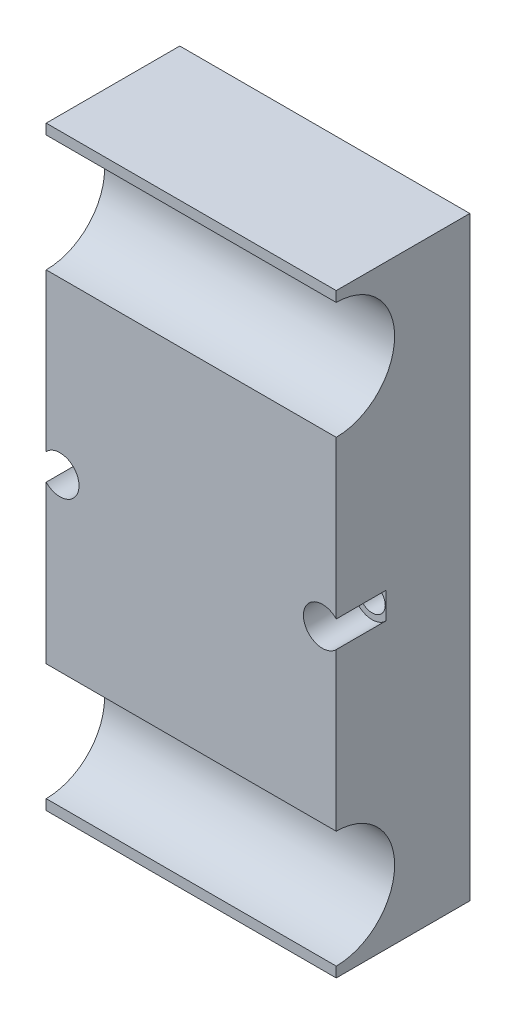
ISO-10303-21;
HEADER;
FILE_DESCRIPTION(('STEP AP214'),'2;1');
FILE_NAME('part.step','',(''),(''),'','','');
FILE_SCHEMA(('AUTOMOTIVE_DESIGN { 1 0 10303 214 1 1 1 1 }'));
ENDSEC;
DATA;
#1=APPLICATION_CONTEXT('core data for automotive mechanical design processes');
#2=APPLICATION_PROTOCOL_DEFINITION('international standard','automotive_design',2000,#1);
#3=PRODUCT_CONTEXT('',#1,'mechanical');
#4=PRODUCT('Part','Part','',(#3));
#5=PRODUCT_RELATED_PRODUCT_CATEGORY('part','',(#4));
#6=PRODUCT_DEFINITION_FORMATION('','',#4);
#7=PRODUCT_DEFINITION_CONTEXT('part definition',#1,'design');
#8=PRODUCT_DEFINITION('design','',#6,#7);
#9=PRODUCT_DEFINITION_SHAPE('','',#8);
#10=(LENGTH_UNIT() NAMED_UNIT(*) SI_UNIT(.MILLI.,.METRE.));
#11=(NAMED_UNIT(*) PLANE_ANGLE_UNIT() SI_UNIT($,.RADIAN.));
#12=(NAMED_UNIT(*) SI_UNIT($,.STERADIAN.) SOLID_ANGLE_UNIT());
#13=UNCERTAINTY_MEASURE_WITH_UNIT(LENGTH_MEASURE(1.E-05),#10,'distance_accuracy_value','');
#14=(GEOMETRIC_REPRESENTATION_CONTEXT(3) GLOBAL_UNCERTAINTY_ASSIGNED_CONTEXT((#13)) GLOBAL_UNIT_ASSIGNED_CONTEXT((#10,
#11,#12)) REPRESENTATION_CONTEXT('',''));
#15=CARTESIAN_POINT('',(0.,0.,0.));
#16=DIRECTION('',(0.,0.,1.));
#17=DIRECTION('',(1.,0.,0.));
#18=AXIS2_PLACEMENT_3D('',#15,#16,#17);
#19=CARTESIAN_POINT('',(36.2,39.,0.));
#20=DIRECTION('',(0.,0.,1.));
#21=DIRECTION('',(1.,0.,0.));
#22=AXIS2_PLACEMENT_3D('',#19,#20,#21);
#23=CYLINDRICAL_SURFACE('',#22,1.725);
#24=CARTESIAN_POINT('',(36.2,39.,0.));
#25=DIRECTION('',(0.,0.,1.));
#26=DIRECTION('',(1.,0.,0.));
#27=AXIS2_PLACEMENT_3D('',#24,#25,#26);
#28=CIRCLE('',#27,1.725);
#29=CARTESIAN_POINT('',(36.25,37.275724789948,0.));
#30=VERTEX_POINT('',#29);
#31=CARTESIAN_POINT('',(36.25,40.724275210052,0.));
#32=VERTEX_POINT('',#31);
#33=EDGE_CURVE('E423',#30,#32,#28,.T.);
#34=ORIENTED_EDGE('',*,*,#33,.F.);
#35=DIRECTION('',(0.,0.,1.));
#36=VECTOR('',#35,1.);
#37=CARTESIAN_POINT('',(36.25,37.275724789948,0.));
#38=LINE('',#37,#36);
#39=CARTESIAN_POINT('',(36.25,37.275724789948,1.));
#40=VERTEX_POINT('',#39);
#41=EDGE_CURVE('E426',#40,#30,#38,.F.);
#42=ORIENTED_EDGE('',*,*,#41,.F.);
#43=CARTESIAN_POINT('',(36.2,39.,1.));
#44=DIRECTION('',(0.,0.,-1.));
#45=DIRECTION('',(-1.,0.,0.));
#46=AXIS2_PLACEMENT_3D('',#43,#44,#45);
#47=CIRCLE('',#46,1.725);
#48=CARTESIAN_POINT('',(36.25,40.724275210052,1.));
#49=VERTEX_POINT('',#48);
#50=EDGE_CURVE('E400',#40,#49,#47,.T.);
#51=ORIENTED_EDGE('',*,*,#50,.T.);
#52=DIRECTION('',(0.,0.,1.));
#53=VECTOR('',#52,1.);
#54=CARTESIAN_POINT('',(36.25,40.724275210052,0.));
#55=LINE('',#54,#53);
#56=EDGE_CURVE('E429',#32,#49,#55,.T.);
#57=ORIENTED_EDGE('',*,*,#56,.F.);
#58=EDGE_LOOP('',(#34,#42,#51,#57));
#59=FACE_BOUND('',#58,.T.);
#60=CARTESIAN_POINT('',(36.2,39.,11.));
#61=DIRECTION('',(0.,0.,1.));
#62=DIRECTION('',(1.,0.,0.));
#63=AXIS2_PLACEMENT_3D('',#60,#61,#62);
#64=CIRCLE('',#63,1.725);
#65=CARTESIAN_POINT('',(37.925,39.,11.));
#66=VERTEX_POINT('',#65);
#67=EDGE_CURVE('E411',#66,#66,#64,.F.);
#68=ORIENTED_EDGE('',*,*,#67,.F.);
#69=EDGE_LOOP('',(#68));
#70=FACE_BOUND('',#69,.T.);
#71=ADVANCED_FACE('F35',(#59,#70),#23,.F.);
#72=CARTESIAN_POINT('',(1.8,39.,0.));
#73=DIRECTION('',(0.,0.,1.));
#74=DIRECTION('',(1.,0.,0.));
#75=AXIS2_PLACEMENT_3D('',#72,#73,#74);
#76=CYLINDRICAL_SURFACE('',#75,1.725);
#77=CARTESIAN_POINT('',(1.8,39.,0.));
#78=DIRECTION('',(0.,0.,1.));
#79=DIRECTION('',(1.,0.,0.));
#80=AXIS2_PLACEMENT_3D('',#77,#78,#79);
#81=CIRCLE('',#80,1.725);
#82=CARTESIAN_POINT('',(1.75000000000001,40.724275210052,0.));
#83=VERTEX_POINT('',#82);
#84=CARTESIAN_POINT('',(1.75,37.275724789948,0.));
#85=VERTEX_POINT('',#84);
#86=EDGE_CURVE('E432',#83,#85,#81,.T.);
#87=ORIENTED_EDGE('',*,*,#86,.F.);
#88=DIRECTION('',(0.,0.,1.));
#89=VECTOR('',#88,1.);
#90=CARTESIAN_POINT('',(1.75000000000001,40.724275210052,0.));
#91=LINE('',#90,#89);
#92=CARTESIAN_POINT('',(1.75000000000001,40.724275210052,1.));
#93=VERTEX_POINT('',#92);
#94=EDGE_CURVE('E435',#93,#83,#91,.F.);
#95=ORIENTED_EDGE('',*,*,#94,.F.);
#96=CARTESIAN_POINT('',(1.8,39.,1.));
#97=DIRECTION('',(0.,0.,-1.));
#98=DIRECTION('',(-1.,0.,0.));
#99=AXIS2_PLACEMENT_3D('',#96,#97,#98);
#100=CIRCLE('',#99,1.725);
#101=CARTESIAN_POINT('',(1.75,37.275724789948,1.));
#102=VERTEX_POINT('',#101);
#103=EDGE_CURVE('E398',#93,#102,#100,.T.);
#104=ORIENTED_EDGE('',*,*,#103,.T.);
#105=DIRECTION('',(0.,0.,1.));
#106=VECTOR('',#105,1.);
#107=CARTESIAN_POINT('',(1.75,37.275724789948,0.));
#108=LINE('',#107,#106);
#109=EDGE_CURVE('E438',#85,#102,#108,.T.);
#110=ORIENTED_EDGE('',*,*,#109,.F.);
#111=EDGE_LOOP('',(#87,#95,#104,#110));
#112=FACE_BOUND('',#111,.T.);
#113=CARTESIAN_POINT('',(1.8,39.,11.));
#114=DIRECTION('',(0.,0.,1.));
#115=DIRECTION('',(1.,0.,0.));
#116=AXIS2_PLACEMENT_3D('',#113,#114,#115);
#117=CIRCLE('',#116,1.725);
#118=CARTESIAN_POINT('',(3.525,39.,11.));
#119=VERTEX_POINT('',#118);
#120=EDGE_CURVE('E403',#119,#119,#117,.F.);
#121=ORIENTED_EDGE('',*,*,#120,.F.);
#122=EDGE_LOOP('',(#121));
#123=FACE_BOUND('',#122,.T.);
#124=ADVANCED_FACE('F536',(#112,#123),#76,.F.);
#125=CARTESIAN_POINT('',(36.25,76.25,1.));
#126=DIRECTION('',(1.,0.,0.));
#127=DIRECTION('',(0.,1.,0.));
#128=AXIS2_PLACEMENT_3D('',#125,#126,#127);
#129=PLANE('',#128);
#130=DIRECTION('',(0.,-1.,0.));
#131=VECTOR('',#130,1.);
#132=CARTESIAN_POINT('',(36.25,76.25,0.));
#133=LINE('',#132,#131);
#134=CARTESIAN_POINT('',(36.25,76.25,0.));
#135=VERTEX_POINT('',#134);
#136=EDGE_CURVE('E469',#135,#32,#133,.T.);
#137=ORIENTED_EDGE('',*,*,#136,.T.);
#138=ORIENTED_EDGE('',*,*,#56,.T.);
#139=DIRECTION('',(0.,-1.,0.));
#140=VECTOR('',#139,1.);
#141=CARTESIAN_POINT('',(36.25,76.25,1.));
#142=LINE('',#141,#140);
#143=CARTESIAN_POINT('',(36.25,76.25,1.));
#144=VERTEX_POINT('',#143);
#145=EDGE_CURVE('E454',#144,#49,#142,.T.);
#146=ORIENTED_EDGE('',*,*,#145,.F.);
#147=DIRECTION('',(0.,0.,-1.));
#148=VECTOR('',#147,1.);
#149=CARTESIAN_POINT('',(36.25,76.25,1.));
#150=LINE('',#149,#148);
#151=EDGE_CURVE('E482',#144,#135,#150,.T.);
#152=ORIENTED_EDGE('',*,*,#151,.T.);
#153=EDGE_LOOP('',(#137,#138,#146,#152));
#154=FACE_BOUND('',#153,.T.);
#155=ADVANCED_FACE('F541',(#154),#129,.F.);
#156=CARTESIAN_POINT('',(1.75000000000001,76.25,1.));
#157=DIRECTION('',(-1.,0.,0.));
#158=DIRECTION('',(0.,-1.,0.));
#159=AXIS2_PLACEMENT_3D('',#156,#157,#158);
#160=PLANE('',#159);
#161=DIRECTION('',(0.,1.,0.));
#162=VECTOR('',#161,1.);
#163=CARTESIAN_POINT('',(1.75000000000001,76.25,0.));
#164=LINE('',#163,#162);
#165=CARTESIAN_POINT('',(1.75,1.75,0.));
#166=VERTEX_POINT('',#165);
#167=EDGE_CURVE('E476',#166,#85,#164,.T.);
#168=ORIENTED_EDGE('',*,*,#167,.T.);
#169=ORIENTED_EDGE('',*,*,#109,.T.);
#170=DIRECTION('',(0.,1.,0.));
#171=VECTOR('',#170,1.);
#172=CARTESIAN_POINT('',(1.75000000000001,76.25,1.));
#173=LINE('',#172,#171);
#174=CARTESIAN_POINT('',(1.75,1.75,1.));
#175=VERTEX_POINT('',#174);
#176=EDGE_CURVE('E462',#175,#102,#173,.T.);
#177=ORIENTED_EDGE('',*,*,#176,.F.);
#178=DIRECTION('',(0.,0.,-1.));
#179=VECTOR('',#178,1.);
#180=CARTESIAN_POINT('',(1.75,1.75,1.));
#181=LINE('',#180,#179);
#182=EDGE_CURVE('E487',#175,#166,#181,.T.);
#183=ORIENTED_EDGE('',*,*,#182,.T.);
#184=EDGE_LOOP('',(#168,#169,#177,#183));
#185=FACE_BOUND('',#184,.T.);
#186=ADVANCED_FACE('F561',(#185),#160,.F.);
#187=CARTESIAN_POINT('',(0.,0.,17.5));
#188=DIRECTION('',(0.,0.,1.));
#189=DIRECTION('',(1.,0.,0.));
#190=AXIS2_PLACEMENT_3D('',#187,#188,#189);
#191=PLANE('',#190);
#192=CARTESIAN_POINT('',(36.2,39.,17.5));
#193=DIRECTION('',(0.,0.,1.));
#194=DIRECTION('',(1.,0.,0.));
#195=AXIS2_PLACEMENT_3D('',#192,#193,#194);
#196=CIRCLE('',#195,2.5);
#197=CARTESIAN_POINT('',(38.,40.7349351572897,17.5));
#198=VERTEX_POINT('',#197);
#199=CARTESIAN_POINT('',(38.,37.2650648427102,17.5));
#200=VERTEX_POINT('',#199);
#201=EDGE_CURVE('E245',#198,#200,#196,.T.);
#202=ORIENTED_EDGE('',*,*,#201,.F.);
#203=DIRECTION('',(0.,1.,0.));
#204=VECTOR('',#203,1.);
#205=CARTESIAN_POINT('',(38.,78.,17.5));
#206=LINE('',#205,#204);
#207=CARTESIAN_POINT('',(38.,61.35,17.5));
#208=VERTEX_POINT('',#207);
#209=EDGE_CURVE('E254',#198,#208,#206,.T.);
#210=ORIENTED_EDGE('',*,*,#209,.T.);
#211=DIRECTION('',(1.,0.,0.));
#212=VECTOR('',#211,1.);
#213=CARTESIAN_POINT('',(0.,61.35,17.5));
#214=LINE('',#213,#212);
#215=CARTESIAN_POINT('',(0.,61.35,17.5));
#216=VERTEX_POINT('',#215);
#217=EDGE_CURVE('E396',#216,#208,#214,.T.);
#218=ORIENTED_EDGE('',*,*,#217,.F.);
#219=DIRECTION('',(0.,-1.,0.));
#220=VECTOR('',#219,1.);
#221=CARTESIAN_POINT('',(0.,78.,17.5));
#222=LINE('',#221,#220);
#223=CARTESIAN_POINT('',(0.,40.7349351572897,17.5));
#224=VERTEX_POINT('',#223);
#225=EDGE_CURVE('E502',#216,#224,#222,.T.);
#226=ORIENTED_EDGE('',*,*,#225,.T.);
#227=CARTESIAN_POINT('',(1.8,39.,17.5));
#228=DIRECTION('',(0.,0.,1.));
#229=DIRECTION('',(1.,0.,0.));
#230=AXIS2_PLACEMENT_3D('',#227,#228,#229);
#231=CIRCLE('',#230,2.5);
#232=CARTESIAN_POINT('',(0.,37.2650648427103,17.5));
#233=VERTEX_POINT('',#232);
#234=EDGE_CURVE('E416',#233,#224,#231,.T.);
#235=ORIENTED_EDGE('',*,*,#234,.F.);
#236=CARTESIAN_POINT('',(0.,16.65,17.5));
#237=VERTEX_POINT('',#236);
#238=EDGE_CURVE('E503',#233,#237,#222,.T.);
#239=ORIENTED_EDGE('',*,*,#238,.T.);
#240=DIRECTION('',(1.,0.,0.));
#241=VECTOR('',#240,1.);
#242=CARTESIAN_POINT('',(0.,16.65,17.5));
#243=LINE('',#242,#241);
#244=CARTESIAN_POINT('',(38.,16.65,17.5));
#245=VERTEX_POINT('',#244);
#246=EDGE_CURVE('E389',#245,#237,#243,.F.);
#247=ORIENTED_EDGE('',*,*,#246,.F.);
#248=EDGE_CURVE('E258',#245,#200,#206,.T.);
#249=ORIENTED_EDGE('',*,*,#248,.T.);
#250=EDGE_LOOP('',(#202,#210,#218,#226,#235,#239,#247,#249));
#251=FACE_BOUND('',#250,.T.);
#252=ADVANCED_FACE('F252',(#251),#191,.T.);
#253=DIRECTION('',(1.,0.,0.));
#254=VECTOR('',#253,1.);
#255=CARTESIAN_POINT('',(0.,1.35,17.5));
#256=LINE('',#255,#254);
#257=CARTESIAN_POINT('',(0.,1.35,17.5));
#258=VERTEX_POINT('',#257);
#259=CARTESIAN_POINT('',(38.,1.35,17.5));
#260=VERTEX_POINT('',#259);
#261=EDGE_CURVE('E392',#258,#260,#256,.T.);
#262=ORIENTED_EDGE('',*,*,#261,.F.);
#263=CARTESIAN_POINT('',(0.,0.,17.5));
#264=VERTEX_POINT('',#263);
#265=EDGE_CURVE('E499',#258,#264,#222,.T.);
#266=ORIENTED_EDGE('',*,*,#265,.T.);
#267=DIRECTION('',(1.,0.,0.));
#268=VECTOR('',#267,1.);
#269=CARTESIAN_POINT('',(0.,0.,17.5));
#270=LINE('',#269,#268);
#271=CARTESIAN_POINT('',(38.,0.,17.5));
#272=VERTEX_POINT('',#271);
#273=EDGE_CURVE('E267',#264,#272,#270,.T.);
#274=ORIENTED_EDGE('',*,*,#273,.T.);
#275=EDGE_CURVE('E266',#272,#260,#206,.T.);
#276=ORIENTED_EDGE('',*,*,#275,.T.);
#277=EDGE_LOOP('',(#262,#266,#274,#276));
#278=FACE_BOUND('',#277,.T.);
#279=ADVANCED_FACE('F505',(#278),#191,.T.);
#280=CARTESIAN_POINT('',(0.,0.,10.));
#281=DIRECTION('',(1.,0.,0.));
#282=DIRECTION('',(0.,0.,-1.));
#283=AXIS2_PLACEMENT_3D('',#280,#281,#282);
#284=PLANE('',#283);
#285=DIRECTION('',(0.,-1.,0.));
#286=VECTOR('',#285,1.);
#287=CARTESIAN_POINT('',(0.,0.,11.));
#288=LINE('',#287,#286);
#289=CARTESIAN_POINT('',(0.,40.7349351572897,11.));
#290=VERTEX_POINT('',#289);
#291=CARTESIAN_POINT('',(0.,37.2650648427103,11.));
#292=VERTEX_POINT('',#291);
#293=EDGE_CURVE('E406',#290,#292,#288,.T.);
#294=ORIENTED_EDGE('',*,*,#293,.F.);
#295=DIRECTION('',(0.,0.,1.));
#296=VECTOR('',#295,1.);
#297=CARTESIAN_POINT('',(0.,40.7349351572897,11.));
#298=LINE('',#297,#296);
#299=EDGE_CURVE('E249',#290,#224,#298,.T.);
#300=ORIENTED_EDGE('',*,*,#299,.T.);
#301=ORIENTED_EDGE('',*,*,#225,.F.);
#302=CARTESIAN_POINT('',(0.,69.,17.5));
#303=DIRECTION('',(1.,0.,0.));
#304=DIRECTION('',(0.,0.,-1.));
#305=AXIS2_PLACEMENT_3D('',#302,#303,#304);
#306=CIRCLE('',#305,7.65);
#307=CARTESIAN_POINT('',(0.,76.65,17.5));
#308=VERTEX_POINT('',#307);
#309=EDGE_CURVE('E491',#216,#308,#306,.T.);
#310=ORIENTED_EDGE('',*,*,#309,.T.);
#311=CARTESIAN_POINT('',(0.,78.,17.5));
#312=VERTEX_POINT('',#311);
#313=EDGE_CURVE('E501',#312,#308,#222,.T.);
#314=ORIENTED_EDGE('',*,*,#313,.F.);
#315=DIRECTION('',(0.,0.,-1.));
#316=VECTOR('',#315,1.);
#317=CARTESIAN_POINT('',(0.,78.,10.));
#318=LINE('',#317,#316);
#319=CARTESIAN_POINT('',(0.,78.,0.));
#320=VERTEX_POINT('',#319);
#321=EDGE_CURVE('E377',#312,#320,#318,.T.);
#322=ORIENTED_EDGE('',*,*,#321,.T.);
#323=DIRECTION('',(0.,-1.,0.));
#324=VECTOR('',#323,1.);
#325=CARTESIAN_POINT('',(0.,0.,0.));
#326=LINE('',#325,#324);
#327=CARTESIAN_POINT('',(0.,0.,0.));
#328=VERTEX_POINT('',#327);
#329=EDGE_CURVE('E360',#320,#328,#326,.T.);
#330=ORIENTED_EDGE('',*,*,#329,.T.);
#331=DIRECTION('',(0.,0.,-1.));
#332=VECTOR('',#331,1.);
#333=CARTESIAN_POINT('',(0.,0.,10.));
#334=LINE('',#333,#332);
#335=EDGE_CURVE('E386',#264,#328,#334,.T.);
#336=ORIENTED_EDGE('',*,*,#335,.F.);
#337=ORIENTED_EDGE('',*,*,#265,.F.);
#338=CARTESIAN_POINT('',(0.,9.,17.5));
#339=DIRECTION('',(1.,0.,0.));
#340=DIRECTION('',(0.,0.,-1.));
#341=AXIS2_PLACEMENT_3D('',#338,#339,#340);
#342=CIRCLE('',#341,7.65);
#343=EDGE_CURVE('E496',#258,#237,#342,.T.);
#344=ORIENTED_EDGE('',*,*,#343,.T.);
#345=ORIENTED_EDGE('',*,*,#238,.F.);
#346=DIRECTION('',(0.,0.,1.));
#347=VECTOR('',#346,1.);
#348=CARTESIAN_POINT('',(0.,37.2650648427103,11.));
#349=LINE('',#348,#347);
#350=EDGE_CURVE('E402',#233,#292,#349,.F.);
#351=ORIENTED_EDGE('',*,*,#350,.T.);
#352=EDGE_LOOP('',(#294,#300,#301,#310,#314,#322,#330,#336,#337,#344,#345,#351));
#353=FACE_BOUND('',#352,.T.);
#354=ADVANCED_FACE('F37',(#353),#284,.F.);
#355=CARTESIAN_POINT('',(0.,0.,10.));
#356=DIRECTION('',(0.,1.,0.));
#357=DIRECTION('',(0.,0.,1.));
#358=AXIS2_PLACEMENT_3D('',#355,#356,#357);
#359=PLANE('',#358);
#360=DIRECTION('',(1.,0.,0.));
#361=VECTOR('',#360,1.);
#362=CARTESIAN_POINT('',(0.,0.,0.));
#363=LINE('',#362,#361);
#364=CARTESIAN_POINT('',(38.,0.,0.));
#365=VERTEX_POINT('',#364);
#366=EDGE_CURVE('E371',#328,#365,#363,.T.);
#367=ORIENTED_EDGE('',*,*,#366,.T.);
#368=DIRECTION('',(0.,0.,-1.));
#369=VECTOR('',#368,1.);
#370=CARTESIAN_POINT('',(38.,0.,10.));
#371=LINE('',#370,#369);
#372=EDGE_CURVE('E383',#272,#365,#371,.T.);
#373=ORIENTED_EDGE('',*,*,#372,.F.);
#374=ORIENTED_EDGE('',*,*,#273,.F.);
#375=ORIENTED_EDGE('',*,*,#335,.T.);
#376=EDGE_LOOP('',(#367,#373,#374,#375));
#377=FACE_BOUND('',#376,.T.);
#378=ADVANCED_FACE('F632',(#377),#359,.F.);
#379=CARTESIAN_POINT('',(38.,0.,10.));
#380=DIRECTION('',(-1.,0.,0.));
#381=DIRECTION('',(0.,0.,1.));
#382=AXIS2_PLACEMENT_3D('',#379,#380,#381);
#383=PLANE('',#382);
#384=DIRECTION('',(0.,1.,0.));
#385=VECTOR('',#384,1.);
#386=CARTESIAN_POINT('',(38.,0.,11.));
#387=LINE('',#386,#385);
#388=CARTESIAN_POINT('',(38.,37.2650648427102,11.));
#389=VERTEX_POINT('',#388);
#390=CARTESIAN_POINT('',(38.,40.7349351572897,11.));
#391=VERTEX_POINT('',#390);
#392=EDGE_CURVE('E413',#389,#391,#387,.T.);
#393=ORIENTED_EDGE('',*,*,#392,.F.);
#394=DIRECTION('',(0.,0.,1.));
#395=VECTOR('',#394,1.);
#396=CARTESIAN_POINT('',(38.,37.2650648427102,11.));
#397=LINE('',#396,#395);
#398=EDGE_CURVE('E11',#389,#200,#397,.T.);
#399=ORIENTED_EDGE('',*,*,#398,.T.);
#400=ORIENTED_EDGE('',*,*,#248,.F.);
#401=CARTESIAN_POINT('',(38.,9.,17.5));
#402=DIRECTION('',(1.,0.,0.));
#403=DIRECTION('',(0.,0.,-1.));
#404=AXIS2_PLACEMENT_3D('',#401,#402,#403);
#405=CIRCLE('',#404,7.65);
#406=EDGE_CURVE('E494',#260,#245,#405,.T.);
#407=ORIENTED_EDGE('',*,*,#406,.F.);
#408=ORIENTED_EDGE('',*,*,#275,.F.);
#409=ORIENTED_EDGE('',*,*,#372,.T.);
#410=DIRECTION('',(0.,1.,0.));
#411=VECTOR('',#410,1.);
#412=CARTESIAN_POINT('',(38.,0.,0.));
#413=LINE('',#412,#411);
#414=CARTESIAN_POINT('',(38.,78.,0.));
#415=VERTEX_POINT('',#414);
#416=EDGE_CURVE('E373',#365,#415,#413,.T.);
#417=ORIENTED_EDGE('',*,*,#416,.T.);
#418=DIRECTION('',(0.,0.,-1.));
#419=VECTOR('',#418,1.);
#420=CARTESIAN_POINT('',(38.,78.,10.));
#421=LINE('',#420,#419);
#422=CARTESIAN_POINT('',(38.,78.,17.5));
#423=VERTEX_POINT('',#422);
#424=EDGE_CURVE('E380',#423,#415,#421,.T.);
#425=ORIENTED_EDGE('',*,*,#424,.F.);
#426=CARTESIAN_POINT('',(38.,76.65,17.5));
#427=VERTEX_POINT('',#426);
#428=EDGE_CURVE('E264',#427,#423,#206,.T.);
#429=ORIENTED_EDGE('',*,*,#428,.F.);
#430=CARTESIAN_POINT('',(38.,69.,17.5));
#431=DIRECTION('',(1.,0.,0.));
#432=DIRECTION('',(0.,0.,-1.));
#433=AXIS2_PLACEMENT_3D('',#430,#431,#432);
#434=CIRCLE('',#433,7.65);
#435=EDGE_CURVE('E263',#208,#427,#434,.T.);
#436=ORIENTED_EDGE('',*,*,#435,.F.);
#437=ORIENTED_EDGE('',*,*,#209,.F.);
#438=DIRECTION('',(0.,0.,1.));
#439=VECTOR('',#438,1.);
#440=CARTESIAN_POINT('',(38.,40.7349351572897,11.));
#441=LINE('',#440,#439);
#442=EDGE_CURVE('E43',#198,#391,#441,.F.);
#443=ORIENTED_EDGE('',*,*,#442,.T.);
#444=EDGE_LOOP('',(#393,#399,#400,#407,#408,#409,#417,#425,#429,#436,#437,#443));
#445=FACE_BOUND('',#444,.T.);
#446=ADVANCED_FACE('F261',(#445),#383,.F.);
#447=CARTESIAN_POINT('',(0.,78.,10.));
#448=DIRECTION('',(0.,-1.,0.));
#449=DIRECTION('',(0.,0.,-1.));
#450=AXIS2_PLACEMENT_3D('',#447,#448,#449);
#451=PLANE('',#450);
#452=DIRECTION('',(-1.,0.,0.));
#453=VECTOR('',#452,1.);
#454=CARTESIAN_POINT('',(0.,78.,0.));
#455=LINE('',#454,#453);
#456=EDGE_CURVE('E375',#415,#320,#455,.T.);
#457=ORIENTED_EDGE('',*,*,#456,.T.);
#458=ORIENTED_EDGE('',*,*,#321,.F.);
#459=DIRECTION('',(-1.,0.,0.));
#460=VECTOR('',#459,1.);
#461=CARTESIAN_POINT('',(0.,78.,17.5));
#462=LINE('',#461,#460);
#463=EDGE_CURVE('E271',#423,#312,#462,.T.);
#464=ORIENTED_EDGE('',*,*,#463,.F.);
#465=ORIENTED_EDGE('',*,*,#424,.T.);
#466=EDGE_LOOP('',(#457,#458,#464,#465));
#467=FACE_BOUND('',#466,.T.);
#468=ADVANCED_FACE('F626',(#467),#451,.F.);
#469=CARTESIAN_POINT('',(0.,0.,0.));
#470=DIRECTION('',(0.,0.,-1.));
#471=DIRECTION('',(-1.,0.,0.));
#472=AXIS2_PLACEMENT_3D('',#469,#470,#471);
#473=PLANE('',#472);
#474=ORIENTED_EDGE('',*,*,#33,.T.);
#475=ORIENTED_EDGE('',*,*,#136,.F.);
#476=DIRECTION('',(1.,0.,0.));
#477=VECTOR('',#476,1.);
#478=CARTESIAN_POINT('',(36.25,76.25,0.));
#479=LINE('',#478,#477);
#480=CARTESIAN_POINT('',(1.75000000000001,76.25,0.));
#481=VERTEX_POINT('',#480);
#482=EDGE_CURVE('E479',#481,#135,#479,.T.);
#483=ORIENTED_EDGE('',*,*,#482,.F.);
#484=EDGE_CURVE('E475',#83,#481,#164,.T.);
#485=ORIENTED_EDGE('',*,*,#484,.F.);
#486=ORIENTED_EDGE('',*,*,#86,.T.);
#487=ORIENTED_EDGE('',*,*,#167,.F.);
#488=DIRECTION('',(-1.,0.,0.));
#489=VECTOR('',#488,1.);
#490=CARTESIAN_POINT('',(36.25,1.75,0.));
#491=LINE('',#490,#489);
#492=CARTESIAN_POINT('',(36.25,1.75,0.));
#493=VERTEX_POINT('',#492);
#494=EDGE_CURVE('E472',#493,#166,#491,.T.);
#495=ORIENTED_EDGE('',*,*,#494,.F.);
#496=EDGE_CURVE('E453',#30,#493,#133,.T.);
#497=ORIENTED_EDGE('',*,*,#496,.F.);
#498=EDGE_LOOP('',(#474,#475,#483,#485,#486,#487,#495,#497));
#499=FACE_BOUND('',#498,.T.);
#500=ORIENTED_EDGE('',*,*,#329,.F.);
#501=ORIENTED_EDGE('',*,*,#456,.F.);
#502=ORIENTED_EDGE('',*,*,#416,.F.);
#503=ORIENTED_EDGE('',*,*,#366,.F.);
#504=EDGE_LOOP('',(#500,#501,#502,#503));
#505=FACE_BOUND('',#504,.T.);
#506=ADVANCED_FACE('F577',(#499,#505),#473,.T.);
#507=DIRECTION('',(1.,0.,0.));
#508=VECTOR('',#507,1.);
#509=CARTESIAN_POINT('',(0.,76.65,17.5));
#510=LINE('',#509,#508);
#511=EDGE_CURVE('E394',#427,#308,#510,.F.);
#512=ORIENTED_EDGE('',*,*,#511,.F.);
#513=ORIENTED_EDGE('',*,*,#428,.T.);
#514=ORIENTED_EDGE('',*,*,#463,.T.);
#515=ORIENTED_EDGE('',*,*,#313,.T.);
#516=EDGE_LOOP('',(#512,#513,#514,#515));
#517=FACE_BOUND('',#516,.T.);
#518=ADVANCED_FACE('F574',(#517),#191,.T.);
#519=CARTESIAN_POINT('',(0.,9.,17.5));
#520=DIRECTION('',(1.,0.,0.));
#521=DIRECTION('',(0.,0.,-1.));
#522=AXIS2_PLACEMENT_3D('',#519,#520,#521);
#523=CYLINDRICAL_SURFACE('',#522,7.65);
#524=ORIENTED_EDGE('',*,*,#261,.T.);
#525=ORIENTED_EDGE('',*,*,#406,.T.);
#526=ORIENTED_EDGE('',*,*,#246,.T.);
#527=ORIENTED_EDGE('',*,*,#343,.F.);
#528=EDGE_LOOP('',(#524,#525,#526,#527));
#529=FACE_BOUND('',#528,.T.);
#530=ADVANCED_FACE('F512',(#529),#523,.F.);
#531=CARTESIAN_POINT('',(0.,69.,17.5));
#532=DIRECTION('',(1.,0.,0.));
#533=DIRECTION('',(0.,0.,-1.));
#534=AXIS2_PLACEMENT_3D('',#531,#532,#533);
#535=CYLINDRICAL_SURFACE('',#534,7.65);
#536=ORIENTED_EDGE('',*,*,#217,.T.);
#537=ORIENTED_EDGE('',*,*,#435,.T.);
#538=ORIENTED_EDGE('',*,*,#511,.T.);
#539=ORIENTED_EDGE('',*,*,#309,.F.);
#540=EDGE_LOOP('',(#536,#537,#538,#539));
#541=FACE_BOUND('',#540,.T.);
#542=ADVANCED_FACE('F567',(#541),#535,.F.);
#543=CARTESIAN_POINT('',(36.25,1.75,1.));
#544=VERTEX_POINT('',#543);
#545=EDGE_CURVE('E458',#40,#544,#142,.T.);
#546=ORIENTED_EDGE('',*,*,#545,.F.);
#547=ORIENTED_EDGE('',*,*,#41,.T.);
#548=ORIENTED_EDGE('',*,*,#496,.T.);
#549=DIRECTION('',(0.,0.,-1.));
#550=VECTOR('',#549,1.);
#551=CARTESIAN_POINT('',(36.25,1.75,1.));
#552=LINE('',#551,#550);
#553=EDGE_CURVE('E468',#544,#493,#552,.T.);
#554=ORIENTED_EDGE('',*,*,#553,.F.);
#555=EDGE_LOOP('',(#546,#547,#548,#554));
#556=FACE_BOUND('',#555,.T.);
#557=ADVANCED_FACE('F556',(#556),#129,.F.);
#558=CARTESIAN_POINT('',(36.25,76.25,1.));
#559=DIRECTION('',(0.,1.,0.));
#560=DIRECTION('',(0.,0.,1.));
#561=AXIS2_PLACEMENT_3D('',#558,#559,#560);
#562=PLANE('',#561);
#563=ORIENTED_EDGE('',*,*,#482,.T.);
#564=ORIENTED_EDGE('',*,*,#151,.F.);
#565=DIRECTION('',(1.,0.,0.));
#566=VECTOR('',#565,1.);
#567=CARTESIAN_POINT('',(36.25,76.25,1.));
#568=LINE('',#567,#566);
#569=CARTESIAN_POINT('',(1.75000000000001,76.25,1.));
#570=VERTEX_POINT('',#569);
#571=EDGE_CURVE('E465',#570,#144,#568,.T.);
#572=ORIENTED_EDGE('',*,*,#571,.F.);
#573=DIRECTION('',(0.,0.,-1.));
#574=VECTOR('',#573,1.);
#575=CARTESIAN_POINT('',(1.75000000000001,76.25,1.));
#576=LINE('',#575,#574);
#577=EDGE_CURVE('E484',#570,#481,#576,.T.);
#578=ORIENTED_EDGE('',*,*,#577,.T.);
#579=EDGE_LOOP('',(#563,#564,#572,#578));
#580=FACE_BOUND('',#579,.T.);
#581=ADVANCED_FACE('F552',(#580),#562,.F.);
#582=EDGE_CURVE('E461',#93,#570,#173,.T.);
#583=ORIENTED_EDGE('',*,*,#582,.F.);
#584=ORIENTED_EDGE('',*,*,#94,.T.);
#585=ORIENTED_EDGE('',*,*,#484,.T.);
#586=ORIENTED_EDGE('',*,*,#577,.F.);
#587=EDGE_LOOP('',(#583,#584,#585,#586));
#588=FACE_BOUND('',#587,.T.);
#589=ADVANCED_FACE('F555',(#588),#160,.F.);
#590=CARTESIAN_POINT('',(36.25,1.75,1.));
#591=DIRECTION('',(0.,-1.,0.));
#592=DIRECTION('',(0.,0.,-1.));
#593=AXIS2_PLACEMENT_3D('',#590,#591,#592);
#594=PLANE('',#593);
#595=ORIENTED_EDGE('',*,*,#494,.T.);
#596=ORIENTED_EDGE('',*,*,#182,.F.);
#597=DIRECTION('',(-1.,0.,0.));
#598=VECTOR('',#597,1.);
#599=CARTESIAN_POINT('',(36.25,1.75,1.));
#600=LINE('',#599,#598);
#601=EDGE_CURVE('E457',#544,#175,#600,.T.);
#602=ORIENTED_EDGE('',*,*,#601,.F.);
#603=ORIENTED_EDGE('',*,*,#553,.T.);
#604=EDGE_LOOP('',(#595,#596,#602,#603));
#605=FACE_BOUND('',#604,.T.);
#606=ADVANCED_FACE('F550',(#605),#594,.F.);
#607=CARTESIAN_POINT('',(0.,0.,1.));
#608=DIRECTION('',(0.,0.,-1.));
#609=DIRECTION('',(-1.,0.,0.));
#610=AXIS2_PLACEMENT_3D('',#607,#608,#609);
#611=PLANE('',#610);
#612=ORIENTED_EDGE('',*,*,#50,.F.);
#613=ORIENTED_EDGE('',*,*,#545,.T.);
#614=ORIENTED_EDGE('',*,*,#601,.T.);
#615=ORIENTED_EDGE('',*,*,#176,.T.);
#616=ORIENTED_EDGE('',*,*,#103,.F.);
#617=ORIENTED_EDGE('',*,*,#582,.T.);
#618=ORIENTED_EDGE('',*,*,#571,.T.);
#619=ORIENTED_EDGE('',*,*,#145,.T.);
#620=EDGE_LOOP('',(#612,#613,#614,#615,#616,#617,#618,#619));
#621=FACE_BOUND('',#620,.T.);
#622=DIRECTION('',(1.,0.,0.));
#623=VECTOR('',#622,1.);
#624=CARTESIAN_POINT('',(34.25,74.25,1.));
#625=LINE('',#624,#623);
#626=CARTESIAN_POINT('',(3.75,74.25,1.));
#627=VERTEX_POINT('',#626);
#628=CARTESIAN_POINT('',(34.25,74.25,1.));
#629=VERTEX_POINT('',#628);
#630=EDGE_CURVE('E450',#627,#629,#625,.T.);
#631=ORIENTED_EDGE('',*,*,#630,.F.);
#632=DIRECTION('',(0.,1.,0.));
#633=VECTOR('',#632,1.);
#634=CARTESIAN_POINT('',(3.75,74.25,1.));
#635=LINE('',#634,#633);
#636=CARTESIAN_POINT('',(3.75,3.75,1.));
#637=VERTEX_POINT('',#636);
#638=EDGE_CURVE('E447',#637,#627,#635,.T.);
#639=ORIENTED_EDGE('',*,*,#638,.F.);
#640=DIRECTION('',(-1.,0.,0.));
#641=VECTOR('',#640,1.);
#642=CARTESIAN_POINT('',(34.25,3.75,1.));
#643=LINE('',#642,#641);
#644=CARTESIAN_POINT('',(34.25,3.75,1.));
#645=VERTEX_POINT('',#644);
#646=EDGE_CURVE('E444',#645,#637,#643,.T.);
#647=ORIENTED_EDGE('',*,*,#646,.F.);
#648=DIRECTION('',(0.,-1.,0.));
#649=VECTOR('',#648,1.);
#650=CARTESIAN_POINT('',(34.25,74.25,1.));
#651=LINE('',#650,#649);
#652=EDGE_CURVE('E441',#629,#645,#651,.T.);
#653=ORIENTED_EDGE('',*,*,#652,.F.);
#654=EDGE_LOOP('',(#631,#639,#647,#653));
#655=FACE_BOUND('',#654,.T.);
#656=ADVANCED_FACE('F546',(#621,#655),#611,.T.);
#657=CARTESIAN_POINT('',(30.25,3.75,4.));
#658=DIRECTION('',(0.707106781186548,-0.707106781186547,0.));
#659=DIRECTION('',(0.707106781186547,0.707106781186548,0.));
#660=AXIS2_PLACEMENT_3D('',#657,#658,#659);
#661=PLANE('',#660);
#662=DIRECTION('',(0.707106781186547,0.707106781186548,0.));
#663=VECTOR('',#662,1.);
#664=CARTESIAN_POINT('',(30.25,3.75,8.));
#665=LINE('',#664,#663);
#666=CARTESIAN_POINT('',(30.25,3.75,8.));
#667=VERTEX_POINT('',#666);
#668=CARTESIAN_POINT('',(34.25,7.75000000000001,8.));
#669=VERTEX_POINT('',#668);
#670=EDGE_CURVE('E277',#667,#669,#665,.T.);
#671=ORIENTED_EDGE('',*,*,#670,.T.);
#672=DIRECTION('',(0.,0.,1.));
#673=VECTOR('',#672,1.);
#674=CARTESIAN_POINT('',(34.25,7.75000000000001,4.));
#675=LINE('',#674,#673);
#676=CARTESIAN_POINT('',(34.25,7.75000000000001,4.));
#677=VERTEX_POINT('',#676);
#678=EDGE_CURVE('E293',#677,#669,#675,.T.);
#679=ORIENTED_EDGE('',*,*,#678,.F.);
#680=DIRECTION('',(0.707106781186547,0.707106781186548,0.));
#681=VECTOR('',#680,1.);
#682=CARTESIAN_POINT('',(30.25,3.75,4.));
#683=LINE('',#682,#681);
#684=CARTESIAN_POINT('',(30.25,3.75,4.));
#685=VERTEX_POINT('',#684);
#686=EDGE_CURVE('E282',#685,#677,#683,.T.);
#687=ORIENTED_EDGE('',*,*,#686,.F.);
#688=DIRECTION('',(0.,0.,1.));
#689=VECTOR('',#688,1.);
#690=CARTESIAN_POINT('',(30.25,3.75,4.));
#691=LINE('',#690,#689);
#692=EDGE_CURVE('E290',#685,#667,#691,.T.);
#693=ORIENTED_EDGE('',*,*,#692,.T.);
#694=EDGE_LOOP('',(#671,#679,#687,#693));
#695=FACE_BOUND('',#694,.T.);
#696=ADVANCED_FACE('F549',(#695),#661,.F.);
#697=CARTESIAN_POINT('',(0.,0.,4.));
#698=DIRECTION('',(0.,0.,-1.));
#699=DIRECTION('',(-1.,0.,0.));
#700=AXIS2_PLACEMENT_3D('',#697,#698,#699);
#701=PLANE('',#700);
#702=ORIENTED_EDGE('',*,*,#686,.T.);
#703=DIRECTION('',(0.,-1.,0.));
#704=VECTOR('',#703,1.);
#705=CARTESIAN_POINT('',(34.25,7.75000000000001,4.));
#706=LINE('',#705,#704);
#707=CARTESIAN_POINT('',(34.25,3.75,4.));
#708=VERTEX_POINT('',#707);
#709=EDGE_CURVE('E287',#677,#708,#706,.T.);
#710=ORIENTED_EDGE('',*,*,#709,.T.);
#711=DIRECTION('',(-1.,0.,0.));
#712=VECTOR('',#711,1.);
#713=CARTESIAN_POINT('',(34.25,3.75,4.));
#714=LINE('',#713,#712);
#715=EDGE_CURVE('E289',#708,#685,#714,.T.);
#716=ORIENTED_EDGE('',*,*,#715,.T.);
#717=EDGE_LOOP('',(#702,#710,#716));
#718=FACE_BOUND('',#717,.T.);
#719=ADVANCED_FACE('F578',(#718),#701,.T.);
#720=CARTESIAN_POINT('',(0.,0.,4.));
#721=DIRECTION('',(0.,0.,1.));
#722=DIRECTION('',(1.,0.,0.));
#723=AXIS2_PLACEMENT_3D('',#720,#721,#722);
#724=PLANE('',#723);
#725=DIRECTION('',(0.707106781186547,-0.707106781186548,0.));
#726=VECTOR('',#725,1.);
#727=CARTESIAN_POINT('',(7.75,3.75,4.));
#728=LINE('',#727,#726);
#729=CARTESIAN_POINT('',(3.75,7.75000000000001,4.));
#730=VERTEX_POINT('',#729);
#731=CARTESIAN_POINT('',(7.75,3.75,4.));
#732=VERTEX_POINT('',#731);
#733=EDGE_CURVE('E297',#730,#732,#728,.T.);
#734=ORIENTED_EDGE('',*,*,#733,.T.);
#735=DIRECTION('',(-1.,0.,0.));
#736=VECTOR('',#735,1.);
#737=CARTESIAN_POINT('',(3.75,3.75,4.));
#738=LINE('',#737,#736);
#739=CARTESIAN_POINT('',(3.75,3.75,4.));
#740=VERTEX_POINT('',#739);
#741=EDGE_CURVE('E300',#732,#740,#738,.T.);
#742=ORIENTED_EDGE('',*,*,#741,.T.);
#743=DIRECTION('',(0.,1.,0.));
#744=VECTOR('',#743,1.);
#745=CARTESIAN_POINT('',(3.75,7.75000000000001,4.));
#746=LINE('',#745,#744);
#747=EDGE_CURVE('E303',#740,#730,#746,.T.);
#748=ORIENTED_EDGE('',*,*,#747,.T.);
#749=EDGE_LOOP('',(#734,#742,#748));
#750=FACE_BOUND('',#749,.T.);
#751=ADVANCED_FACE('F581',(#750),#724,.F.);
#752=CARTESIAN_POINT('',(7.75,3.75,4.));
#753=DIRECTION('',(-0.707106781186548,-0.707106781186547,0.));
#754=DIRECTION('',(0.707106781186547,-0.707106781186548,0.));
#755=AXIS2_PLACEMENT_3D('',#752,#753,#754);
#756=PLANE('',#755);
#757=DIRECTION('',(0.707106781186547,-0.707106781186548,0.));
#758=VECTOR('',#757,1.);
#759=CARTESIAN_POINT('',(7.75,3.75,8.));
#760=LINE('',#759,#758);
#761=CARTESIAN_POINT('',(3.75,7.75000000000001,8.));
#762=VERTEX_POINT('',#761);
#763=CARTESIAN_POINT('',(7.75,3.75,8.));
#764=VERTEX_POINT('',#763);
#765=EDGE_CURVE('E296',#762,#764,#760,.T.);
#766=ORIENTED_EDGE('',*,*,#765,.T.);
#767=DIRECTION('',(0.,0.,1.));
#768=VECTOR('',#767,1.);
#769=CARTESIAN_POINT('',(7.75,3.75,4.));
#770=LINE('',#769,#768);
#771=EDGE_CURVE('E311',#732,#764,#770,.T.);
#772=ORIENTED_EDGE('',*,*,#771,.F.);
#773=ORIENTED_EDGE('',*,*,#733,.F.);
#774=DIRECTION('',(0.,0.,1.));
#775=VECTOR('',#774,1.);
#776=CARTESIAN_POINT('',(3.75,7.75000000000001,4.));
#777=LINE('',#776,#775);
#778=EDGE_CURVE('E306',#730,#762,#777,.T.);
#779=ORIENTED_EDGE('',*,*,#778,.T.);
#780=EDGE_LOOP('',(#766,#772,#773,#779));
#781=FACE_BOUND('',#780,.T.);
#782=ADVANCED_FACE('F588',(#781),#756,.F.);
#783=CARTESIAN_POINT('',(0.,0.,4.));
#784=DIRECTION('',(0.,0.,-1.));
#785=DIRECTION('',(-1.,0.,0.));
#786=AXIS2_PLACEMENT_3D('',#783,#784,#785);
#787=PLANE('',#786);
#788=DIRECTION('',(-0.707106781186547,-0.707106781186548,0.));
#789=VECTOR('',#788,1.);
#790=CARTESIAN_POINT('',(7.75,74.25,4.));
#791=LINE('',#790,#789);
#792=CARTESIAN_POINT('',(7.75,74.25,4.));
#793=VERTEX_POINT('',#792);
#794=CARTESIAN_POINT('',(3.75,70.25,4.));
#795=VERTEX_POINT('',#794);
#796=EDGE_CURVE('E315',#793,#795,#791,.T.);
#797=ORIENTED_EDGE('',*,*,#796,.T.);
#798=DIRECTION('',(0.,1.,0.));
#799=VECTOR('',#798,1.);
#800=CARTESIAN_POINT('',(3.75,70.25,4.));
#801=LINE('',#800,#799);
#802=CARTESIAN_POINT('',(3.75,74.25,4.));
#803=VERTEX_POINT('',#802);
#804=EDGE_CURVE('E318',#795,#803,#801,.T.);
#805=ORIENTED_EDGE('',*,*,#804,.T.);
#806=DIRECTION('',(1.,0.,0.));
#807=VECTOR('',#806,1.);
#808=CARTESIAN_POINT('',(3.75,74.25,4.));
#809=LINE('',#808,#807);
#810=EDGE_CURVE('E320',#803,#793,#809,.T.);
#811=ORIENTED_EDGE('',*,*,#810,.T.);
#812=EDGE_LOOP('',(#797,#805,#811));
#813=FACE_BOUND('',#812,.T.);
#814=ADVANCED_FACE('F592',(#813),#787,.T.);
#815=CARTESIAN_POINT('',(7.75,74.25,4.));
#816=DIRECTION('',(-0.707106781186548,0.707106781186547,0.));
#817=DIRECTION('',(-0.707106781186547,-0.707106781186548,0.));
#818=AXIS2_PLACEMENT_3D('',#815,#816,#817);
#819=PLANE('',#818);
#820=DIRECTION('',(-0.707106781186547,-0.707106781186548,0.));
#821=VECTOR('',#820,1.);
#822=CARTESIAN_POINT('',(7.75,74.25,8.));
#823=LINE('',#822,#821);
#824=CARTESIAN_POINT('',(7.75,74.25,8.));
#825=VERTEX_POINT('',#824);
#826=CARTESIAN_POINT('',(3.75,70.25,8.));
#827=VERTEX_POINT('',#826);
#828=EDGE_CURVE('E314',#825,#827,#823,.T.);
#829=ORIENTED_EDGE('',*,*,#828,.T.);
#830=DIRECTION('',(0.,0.,1.));
#831=VECTOR('',#830,1.);
#832=CARTESIAN_POINT('',(3.75,70.25,4.));
#833=LINE('',#832,#831);
#834=EDGE_CURVE('E326',#795,#827,#833,.T.);
#835=ORIENTED_EDGE('',*,*,#834,.F.);
#836=ORIENTED_EDGE('',*,*,#796,.F.);
#837=DIRECTION('',(0.,0.,1.));
#838=VECTOR('',#837,1.);
#839=CARTESIAN_POINT('',(7.75,74.25,4.));
#840=LINE('',#839,#838);
#841=EDGE_CURVE('E322',#793,#825,#840,.T.);
#842=ORIENTED_EDGE('',*,*,#841,.T.);
#843=EDGE_LOOP('',(#829,#835,#836,#842));
#844=FACE_BOUND('',#843,.T.);
#845=ADVANCED_FACE('F596',(#844),#819,.F.);
#846=CARTESIAN_POINT('',(0.,0.,8.));
#847=DIRECTION('',(0.,0.,1.));
#848=DIRECTION('',(1.,0.,0.));
#849=AXIS2_PLACEMENT_3D('',#846,#847,#848);
#850=PLANE('',#849);
#851=ORIENTED_EDGE('',*,*,#670,.F.);
#852=DIRECTION('',(-1.,0.,0.));
#853=VECTOR('',#852,1.);
#854=CARTESIAN_POINT('',(34.25,3.75,8.));
#855=LINE('',#854,#853);
#856=EDGE_CURVE('E350',#667,#764,#855,.T.);
#857=ORIENTED_EDGE('',*,*,#856,.T.);
#858=ORIENTED_EDGE('',*,*,#765,.F.);
#859=DIRECTION('',(0.,1.,0.));
#860=VECTOR('',#859,1.);
#861=CARTESIAN_POINT('',(3.75,3.75,8.));
#862=LINE('',#861,#860);
#863=EDGE_CURVE('E352',#762,#827,#862,.T.);
#864=ORIENTED_EDGE('',*,*,#863,.T.);
#865=ORIENTED_EDGE('',*,*,#828,.F.);
#866=DIRECTION('',(1.,0.,0.));
#867=VECTOR('',#866,1.);
#868=CARTESIAN_POINT('',(34.25,74.25,8.));
#869=LINE('',#868,#867);
#870=CARTESIAN_POINT('',(30.25,74.25,8.));
#871=VERTEX_POINT('',#870);
#872=EDGE_CURVE('E354',#825,#871,#869,.T.);
#873=ORIENTED_EDGE('',*,*,#872,.T.);
#874=DIRECTION('',(-0.707106781186547,0.707106781186548,0.));
#875=VECTOR('',#874,1.);
#876=CARTESIAN_POINT('',(30.25,74.25,8.));
#877=LINE('',#876,#875);
#878=CARTESIAN_POINT('',(34.25,70.25,8.));
#879=VERTEX_POINT('',#878);
#880=EDGE_CURVE('E329',#879,#871,#877,.T.);
#881=ORIENTED_EDGE('',*,*,#880,.F.);
#882=DIRECTION('',(0.,-1.,0.));
#883=VECTOR('',#882,1.);
#884=CARTESIAN_POINT('',(34.25,3.75,8.));
#885=LINE('',#884,#883);
#886=EDGE_CURVE('E347',#879,#669,#885,.T.);
#887=ORIENTED_EDGE('',*,*,#886,.T.);
#888=EDGE_LOOP('',(#851,#857,#858,#864,#865,#873,#881,#887));
#889=FACE_BOUND('',#888,.T.);
#890=ADVANCED_FACE('F600',(#889),#850,.F.);
#891=CARTESIAN_POINT('',(30.25,74.25,4.));
#892=DIRECTION('',(0.707106781186548,0.707106781186547,0.));
#893=DIRECTION('',(-0.707106781186547,0.707106781186548,0.));
#894=AXIS2_PLACEMENT_3D('',#891,#892,#893);
#895=PLANE('',#894);
#896=ORIENTED_EDGE('',*,*,#880,.T.);
#897=DIRECTION('',(0.,0.,1.));
#898=VECTOR('',#897,1.);
#899=CARTESIAN_POINT('',(30.25,74.25,4.));
#900=LINE('',#899,#898);
#901=CARTESIAN_POINT('',(30.25,74.25,4.));
#902=VERTEX_POINT('',#901);
#903=EDGE_CURVE('E339',#902,#871,#900,.T.);
#904=ORIENTED_EDGE('',*,*,#903,.F.);
#905=DIRECTION('',(-0.707106781186547,0.707106781186548,0.));
#906=VECTOR('',#905,1.);
#907=CARTESIAN_POINT('',(30.25,74.25,4.));
#908=LINE('',#907,#906);
#909=CARTESIAN_POINT('',(34.25,70.25,4.));
#910=VERTEX_POINT('',#909);
#911=EDGE_CURVE('E336',#910,#902,#908,.T.);
#912=ORIENTED_EDGE('',*,*,#911,.F.);
#913=DIRECTION('',(0.,0.,1.));
#914=VECTOR('',#913,1.);
#915=CARTESIAN_POINT('',(34.25,70.25,4.));
#916=LINE('',#915,#914);
#917=EDGE_CURVE('E344',#910,#879,#916,.T.);
#918=ORIENTED_EDGE('',*,*,#917,.T.);
#919=EDGE_LOOP('',(#896,#904,#912,#918));
#920=FACE_BOUND('',#919,.T.);
#921=ADVANCED_FACE('F606',(#920),#895,.F.);
#922=CARTESIAN_POINT('',(0.,0.,4.));
#923=DIRECTION('',(0.,0.,-1.));
#924=DIRECTION('',(-1.,0.,0.));
#925=AXIS2_PLACEMENT_3D('',#922,#923,#924);
#926=PLANE('',#925);
#927=DIRECTION('',(1.,0.,0.));
#928=VECTOR('',#927,1.);
#929=CARTESIAN_POINT('',(34.25,74.25,4.));
#930=LINE('',#929,#928);
#931=CARTESIAN_POINT('',(34.25,74.25,4.));
#932=VERTEX_POINT('',#931);
#933=EDGE_CURVE('E330',#902,#932,#930,.T.);
#934=ORIENTED_EDGE('',*,*,#933,.T.);
#935=DIRECTION('',(0.,-1.,0.));
#936=VECTOR('',#935,1.);
#937=CARTESIAN_POINT('',(34.25,70.25,4.));
#938=LINE('',#937,#936);
#939=EDGE_CURVE('E333',#932,#910,#938,.T.);
#940=ORIENTED_EDGE('',*,*,#939,.T.);
#941=ORIENTED_EDGE('',*,*,#911,.T.);
#942=EDGE_LOOP('',(#934,#940,#941));
#943=FACE_BOUND('',#942,.T.);
#944=ADVANCED_FACE('F602',(#943),#926,.T.);
#945=CARTESIAN_POINT('',(34.25,74.25,8.));
#946=DIRECTION('',(0.,1.,0.));
#947=DIRECTION('',(0.,0.,1.));
#948=AXIS2_PLACEMENT_3D('',#945,#946,#947);
#949=PLANE('',#948);
#950=ORIENTED_EDGE('',*,*,#630,.T.);
#951=DIRECTION('',(0.,0.,-1.));
#952=VECTOR('',#951,1.);
#953=CARTESIAN_POINT('',(34.25,74.25,8.));
#954=LINE('',#953,#952);
#955=EDGE_CURVE('E357',#932,#629,#954,.T.);
#956=ORIENTED_EDGE('',*,*,#955,.F.);
#957=ORIENTED_EDGE('',*,*,#933,.F.);
#958=ORIENTED_EDGE('',*,*,#903,.T.);
#959=ORIENTED_EDGE('',*,*,#872,.F.);
#960=ORIENTED_EDGE('',*,*,#841,.F.);
#961=ORIENTED_EDGE('',*,*,#810,.F.);
#962=DIRECTION('',(0.,0.,-1.));
#963=VECTOR('',#962,1.);
#964=CARTESIAN_POINT('',(3.75,74.25,8.));
#965=LINE('',#964,#963);
#966=EDGE_CURVE('E361',#803,#627,#965,.T.);
#967=ORIENTED_EDGE('',*,*,#966,.T.);
#968=EDGE_LOOP('',(#950,#956,#957,#958,#959,#960,#961,#967));
#969=FACE_BOUND('',#968,.T.);
#970=ADVANCED_FACE('F605',(#969),#949,.F.);
#971=CARTESIAN_POINT('',(3.75,3.75,8.));
#972=DIRECTION('',(-1.,0.,0.));
#973=DIRECTION('',(0.,0.,1.));
#974=AXIS2_PLACEMENT_3D('',#971,#972,#973);
#975=PLANE('',#974);
#976=ORIENTED_EDGE('',*,*,#638,.T.);
#977=ORIENTED_EDGE('',*,*,#966,.F.);
#978=ORIENTED_EDGE('',*,*,#804,.F.);
#979=ORIENTED_EDGE('',*,*,#834,.T.);
#980=ORIENTED_EDGE('',*,*,#863,.F.);
#981=ORIENTED_EDGE('',*,*,#778,.F.);
#982=ORIENTED_EDGE('',*,*,#747,.F.);
#983=DIRECTION('',(0.,0.,-1.));
#984=VECTOR('',#983,1.);
#985=CARTESIAN_POINT('',(3.75,3.75,8.));
#986=LINE('',#985,#984);
#987=EDGE_CURVE('E364',#740,#637,#986,.T.);
#988=ORIENTED_EDGE('',*,*,#987,.T.);
#989=EDGE_LOOP('',(#976,#977,#978,#979,#980,#981,#982,#988));
#990=FACE_BOUND('',#989,.T.);
#991=ADVANCED_FACE('F616',(#990),#975,.F.);
#992=CARTESIAN_POINT('',(34.25,3.75,8.));
#993=DIRECTION('',(1.,0.,0.));
#994=DIRECTION('',(0.,0.,-1.));
#995=AXIS2_PLACEMENT_3D('',#992,#993,#994);
#996=PLANE('',#995);
#997=ORIENTED_EDGE('',*,*,#652,.T.);
#998=DIRECTION('',(0.,0.,-1.));
#999=VECTOR('',#998,1.);
#1000=CARTESIAN_POINT('',(34.25,3.75,8.));
#1001=LINE('',#1000,#999);
#1002=EDGE_CURVE('E356',#708,#645,#1001,.T.);
#1003=ORIENTED_EDGE('',*,*,#1002,.F.);
#1004=ORIENTED_EDGE('',*,*,#709,.F.);
#1005=ORIENTED_EDGE('',*,*,#678,.T.);
#1006=ORIENTED_EDGE('',*,*,#886,.F.);
#1007=ORIENTED_EDGE('',*,*,#917,.F.);
#1008=ORIENTED_EDGE('',*,*,#939,.F.);
#1009=ORIENTED_EDGE('',*,*,#955,.T.);
#1010=EDGE_LOOP('',(#997,#1003,#1004,#1005,#1006,#1007,#1008,#1009));
#1011=FACE_BOUND('',#1010,.T.);
#1012=ADVANCED_FACE('F531',(#1011),#996,.F.);
#1013=CARTESIAN_POINT('',(34.25,3.75,8.));
#1014=DIRECTION('',(0.,-1.,0.));
#1015=DIRECTION('',(0.,0.,-1.));
#1016=AXIS2_PLACEMENT_3D('',#1013,#1014,#1015);
#1017=PLANE('',#1016);
#1018=ORIENTED_EDGE('',*,*,#646,.T.);
#1019=ORIENTED_EDGE('',*,*,#987,.F.);
#1020=ORIENTED_EDGE('',*,*,#741,.F.);
#1021=ORIENTED_EDGE('',*,*,#771,.T.);
#1022=ORIENTED_EDGE('',*,*,#856,.F.);
#1023=ORIENTED_EDGE('',*,*,#692,.F.);
#1024=ORIENTED_EDGE('',*,*,#715,.F.);
#1025=ORIENTED_EDGE('',*,*,#1002,.T.);
#1026=EDGE_LOOP('',(#1018,#1019,#1020,#1021,#1022,#1023,#1024,#1025));
#1027=FACE_BOUND('',#1026,.T.);
#1028=ADVANCED_FACE('F523',(#1027),#1017,.F.);
#1029=CARTESIAN_POINT('',(1.8,39.,11.));
#1030=DIRECTION('',(0.,0.,1.));
#1031=DIRECTION('',(1.,0.,0.));
#1032=AXIS2_PLACEMENT_3D('',#1029,#1030,#1031);
#1033=CYLINDRICAL_SURFACE('',#1032,2.5);
#1034=CARTESIAN_POINT('',(1.8,39.,11.));
#1035=DIRECTION('',(0.,0.,1.));
#1036=DIRECTION('',(1.,0.,0.));
#1037=AXIS2_PLACEMENT_3D('',#1034,#1035,#1036);
#1038=CIRCLE('',#1037,2.5);
#1039=EDGE_CURVE('E56',#292,#290,#1038,.T.);
#1040=ORIENTED_EDGE('',*,*,#1039,.F.);
#1041=ORIENTED_EDGE('',*,*,#350,.F.);
#1042=ORIENTED_EDGE('',*,*,#234,.T.);
#1043=ORIENTED_EDGE('',*,*,#299,.F.);
#1044=EDGE_LOOP('',(#1040,#1041,#1042,#1043));
#1045=FACE_BOUND('',#1044,.T.);
#1046=ADVANCED_FACE('F520',(#1045),#1033,.F.);
#1047=CARTESIAN_POINT('',(1.8,39.,11.));
#1048=DIRECTION('',(0.,0.,1.));
#1049=DIRECTION('',(1.,0.,0.));
#1050=AXIS2_PLACEMENT_3D('',#1047,#1048,#1049);
#1051=PLANE('',#1050);
#1052=ORIENTED_EDGE('',*,*,#120,.T.);
#1053=EDGE_LOOP('',(#1052));
#1054=FACE_BOUND('',#1053,.T.);
#1055=ORIENTED_EDGE('',*,*,#293,.T.);
#1056=ORIENTED_EDGE('',*,*,#1039,.T.);
#1057=EDGE_LOOP('',(#1055,#1056));
#1058=FACE_BOUND('',#1057,.T.);
#1059=ADVANCED_FACE('F522',(#1054,#1058),#1051,.T.);
#1060=CARTESIAN_POINT('',(36.2,39.,11.));
#1061=DIRECTION('',(0.,0.,1.));
#1062=DIRECTION('',(1.,0.,0.));
#1063=AXIS2_PLACEMENT_3D('',#1060,#1061,#1062);
#1064=CYLINDRICAL_SURFACE('',#1063,2.5);
#1065=CARTESIAN_POINT('',(36.2,39.,11.));
#1066=DIRECTION('',(0.,0.,1.));
#1067=DIRECTION('',(1.,0.,0.));
#1068=AXIS2_PLACEMENT_3D('',#1065,#1066,#1067);
#1069=CIRCLE('',#1068,2.5);
#1070=EDGE_CURVE('E49',#391,#389,#1069,.T.);
#1071=ORIENTED_EDGE('',*,*,#1070,.F.);
#1072=ORIENTED_EDGE('',*,*,#442,.F.);
#1073=ORIENTED_EDGE('',*,*,#201,.T.);
#1074=ORIENTED_EDGE('',*,*,#398,.F.);
#1075=EDGE_LOOP('',(#1071,#1072,#1073,#1074));
#1076=FACE_BOUND('',#1075,.T.);
#1077=ADVANCED_FACE('F244',(#1076),#1064,.F.);
#1078=CARTESIAN_POINT('',(36.2,39.,11.));
#1079=DIRECTION('',(0.,0.,1.));
#1080=DIRECTION('',(1.,0.,0.));
#1081=AXIS2_PLACEMENT_3D('',#1078,#1079,#1080);
#1082=PLANE('',#1081);
#1083=ORIENTED_EDGE('',*,*,#67,.T.);
#1084=EDGE_LOOP('',(#1083));
#1085=FACE_BOUND('',#1084,.T.);
#1086=ORIENTED_EDGE('',*,*,#392,.T.);
#1087=ORIENTED_EDGE('',*,*,#1070,.T.);
#1088=EDGE_LOOP('',(#1086,#1087));
#1089=FACE_BOUND('',#1088,.T.);
#1090=ADVANCED_FACE('F747',(#1085,#1089),#1082,.T.);
#1091=CLOSED_SHELL('',(#71,#124,#155,#186,#252,#279,#354,#378,#446,#468,#506,#518,#530,#542,
#557,#581,#589,#606,#656,#696,#719,#751,#782,#814,#845,#890,#921,#944,#970,#991,#1012,#1028,
#1046,#1059,#1077,#1090));
#1092=MANIFOLD_SOLID_BREP('B2',#1091);
#1093=ADVANCED_BREP_SHAPE_REPRESENTATION('',(#18,#1092),#14);
#1094=SHAPE_DEFINITION_REPRESENTATION(#9,#1093);
ENDSEC;
END-ISO-10303-21;
